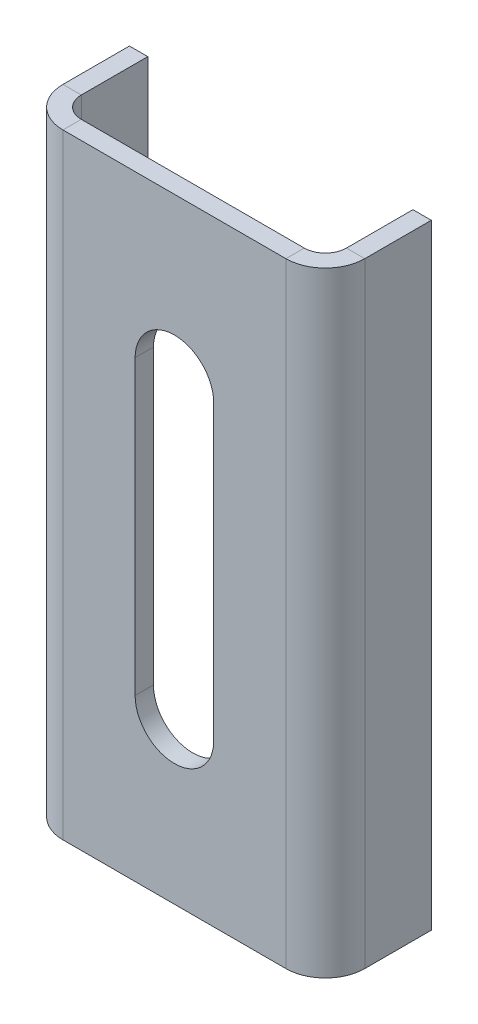
ISO-10303-21;
HEADER;
FILE_DESCRIPTION(('STEP AP214'),'2;1');
FILE_NAME('part.step','',(''),(''),'','','');
FILE_SCHEMA(('AUTOMOTIVE_DESIGN { 1 0 10303 214 1 1 1 1 }'));
ENDSEC;
DATA;
#1=APPLICATION_CONTEXT('core data for automotive mechanical design processes');
#2=APPLICATION_PROTOCOL_DEFINITION('international standard','automotive_design',2000,#1);
#3=PRODUCT_CONTEXT('',#1,'mechanical');
#4=PRODUCT('Part','Part','',(#3));
#5=PRODUCT_RELATED_PRODUCT_CATEGORY('part','',(#4));
#6=PRODUCT_DEFINITION_FORMATION('','',#4);
#7=PRODUCT_DEFINITION_CONTEXT('part definition',#1,'design');
#8=PRODUCT_DEFINITION('design','',#6,#7);
#9=PRODUCT_DEFINITION_SHAPE('','',#8);
#10=(LENGTH_UNIT() NAMED_UNIT(*) SI_UNIT(.MILLI.,.METRE.));
#11=(NAMED_UNIT(*) PLANE_ANGLE_UNIT() SI_UNIT($,.RADIAN.));
#12=(NAMED_UNIT(*) SI_UNIT($,.STERADIAN.) SOLID_ANGLE_UNIT());
#13=UNCERTAINTY_MEASURE_WITH_UNIT(LENGTH_MEASURE(1.E-05),#10,'distance_accuracy_value','');
#14=(GEOMETRIC_REPRESENTATION_CONTEXT(3) GLOBAL_UNCERTAINTY_ASSIGNED_CONTEXT((#13)) GLOBAL_UNIT_ASSIGNED_CONTEXT((#10,
#11,#12)) REPRESENTATION_CONTEXT('',''));
#15=CARTESIAN_POINT('',(0.,0.,0.));
#16=DIRECTION('',(0.,0.,1.));
#17=DIRECTION('',(1.,0.,0.));
#18=AXIS2_PLACEMENT_3D('',#15,#16,#17);
#19=CARTESIAN_POINT('',(2.07,69.36,-2.07));
#20=DIRECTION('',(0.,1.,0.));
#21=DIRECTION('',(-1.,0.,0.));
#22=AXIS2_PLACEMENT_3D('',#19,#20,#21);
#23=PLANE('',#22);
#24=DIRECTION('',(0.,0.,-1.));
#25=VECTOR('',#24,1.);
#26=CARTESIAN_POINT('',(4.450000066,69.36,-2.07));
#27=LINE('',#26,#25);
#28=CARTESIAN_POINT('',(4.450000066,69.36,0.));
#29=VERTEX_POINT('',#28);
#30=CARTESIAN_POINT('',(4.450000066,69.36,-2.07));
#31=VERTEX_POINT('',#30);
#32=EDGE_CURVE('E11',#29,#31,#27,.T.);
#33=ORIENTED_EDGE('',*,*,#32,.F.);
#34=DIRECTION('',(1.,0.,0.));
#35=VECTOR('',#34,1.);
#36=CARTESIAN_POINT('',(2.07,69.36,0.));
#37=LINE('',#36,#35);
#38=CARTESIAN_POINT('',(29.599999934,69.36,0.));
#39=VERTEX_POINT('',#38);
#40=EDGE_CURVE('E270',#39,#29,#37,.F.);
#41=ORIENTED_EDGE('',*,*,#40,.F.);
#42=DIRECTION('',(0.,0.,-1.));
#43=VECTOR('',#42,1.);
#44=CARTESIAN_POINT('',(29.599999934,69.36,-2.07));
#45=LINE('',#44,#43);
#46=CARTESIAN_POINT('',(29.599999934,69.36,-2.07));
#47=VERTEX_POINT('',#46);
#48=EDGE_CURVE('E55',#39,#47,#45,.T.);
#49=ORIENTED_EDGE('',*,*,#48,.T.);
#50=DIRECTION('',(-1.,0.,0.));
#51=VECTOR('',#50,1.);
#52=CARTESIAN_POINT('',(2.07,69.36,-2.07));
#53=LINE('',#52,#51);
#54=EDGE_CURVE('E196',#47,#31,#53,.T.);
#55=ORIENTED_EDGE('',*,*,#54,.T.);
#56=EDGE_LOOP('',(#33,#41,#49,#55));
#57=FACE_BOUND('',#56,.T.);
#58=ADVANCED_FACE('F43',(#57),#23,.T.);
#59=CARTESIAN_POINT('',(29.599999934,69.36,-4.450000066));
#60=DIRECTION('',(0.,1.,0.));
#61=DIRECTION('',(0.,0.,1.));
#62=AXIS2_PLACEMENT_3D('',#59,#60,#61);
#63=PLANE('',#62);
#64=ORIENTED_EDGE('',*,*,#48,.F.);
#65=CARTESIAN_POINT('',(29.599999934,69.36,-4.450000066));
#66=DIRECTION('',(0.,1.,0.));
#67=DIRECTION('',(0.,0.,1.));
#68=AXIS2_PLACEMENT_3D('',#65,#66,#67);
#69=CIRCLE('',#68,4.450000066);
#70=CARTESIAN_POINT('',(34.05,69.36,-4.450000066));
#71=VERTEX_POINT('',#70);
#72=EDGE_CURVE('E266',#39,#71,#69,.T.);
#73=ORIENTED_EDGE('',*,*,#72,.T.);
#74=DIRECTION('',(-1.,0.,0.));
#75=VECTOR('',#74,1.);
#76=CARTESIAN_POINT('',(31.98,69.36,-4.450000066));
#77=LINE('',#76,#75);
#78=CARTESIAN_POINT('',(31.98,69.36,-4.450000066));
#79=VERTEX_POINT('',#78);
#80=EDGE_CURVE('E302',#71,#79,#77,.T.);
#81=ORIENTED_EDGE('',*,*,#80,.T.);
#82=CARTESIAN_POINT('',(29.599999934,69.36,-4.450000066));
#83=DIRECTION('',(0.,-1.,0.));
#84=DIRECTION('',(0.,0.,-1.));
#85=AXIS2_PLACEMENT_3D('',#82,#83,#84);
#86=CIRCLE('',#85,2.380000066);
#87=EDGE_CURVE('E200',#47,#79,#86,.F.);
#88=ORIENTED_EDGE('',*,*,#87,.F.);
#89=EDGE_LOOP('',(#64,#73,#81,#88));
#90=FACE_BOUND('',#89,.T.);
#91=ADVANCED_FACE('F317',(#90),#63,.T.);
#92=CARTESIAN_POINT('',(31.98,69.36,-2.07));
#93=DIRECTION('',(0.,1.,0.));
#94=DIRECTION('',(0.,0.,1.));
#95=AXIS2_PLACEMENT_3D('',#92,#93,#94);
#96=PLANE('',#95);
#97=ORIENTED_EDGE('',*,*,#80,.F.);
#98=DIRECTION('',(0.,0.,-1.));
#99=VECTOR('',#98,1.);
#100=CARTESIAN_POINT('',(34.05,69.36,-2.07));
#101=LINE('',#100,#99);
#102=CARTESIAN_POINT('',(34.05,69.36,-11.95));
#103=VERTEX_POINT('',#102);
#104=EDGE_CURVE('E276',#103,#71,#101,.F.);
#105=ORIENTED_EDGE('',*,*,#104,.F.);
#106=DIRECTION('',(-1.,0.,0.));
#107=VECTOR('',#106,1.);
#108=CARTESIAN_POINT('',(31.98,69.36,-11.95));
#109=LINE('',#108,#107);
#110=CARTESIAN_POINT('',(31.98,69.36,-11.95));
#111=VERTEX_POINT('',#110);
#112=EDGE_CURVE('E305',#103,#111,#109,.T.);
#113=ORIENTED_EDGE('',*,*,#112,.T.);
#114=DIRECTION('',(0.,0.,1.));
#115=VECTOR('',#114,1.);
#116=CARTESIAN_POINT('',(31.98,69.36,-2.07));
#117=LINE('',#116,#115);
#118=EDGE_CURVE('E202',#111,#79,#117,.T.);
#119=ORIENTED_EDGE('',*,*,#118,.T.);
#120=EDGE_LOOP('',(#97,#105,#113,#119));
#121=FACE_BOUND('',#120,.T.);
#122=ADVANCED_FACE('F361',(#121),#96,.T.);
#123=CARTESIAN_POINT('',(31.98,69.36,-11.95));
#124=DIRECTION('',(0.,0.,1.));
#125=DIRECTION('',(0.,-1.,0.));
#126=AXIS2_PLACEMENT_3D('',#123,#124,#125);
#127=PLANE('',#126);
#128=ORIENTED_EDGE('',*,*,#112,.F.);
#129=DIRECTION('',(0.,1.,0.));
#130=VECTOR('',#129,1.);
#131=CARTESIAN_POINT('',(34.05,69.36,-11.95));
#132=LINE('',#131,#130);
#133=CARTESIAN_POINT('',(34.05,0.,-11.95));
#134=VERTEX_POINT('',#133);
#135=EDGE_CURVE('E265',#103,#134,#132,.F.);
#136=ORIENTED_EDGE('',*,*,#135,.T.);
#137=DIRECTION('',(-1.,0.,0.));
#138=VECTOR('',#137,1.);
#139=CARTESIAN_POINT('',(31.98,0.,-11.95));
#140=LINE('',#139,#138);
#141=CARTESIAN_POINT('',(31.98,0.,-11.95));
#142=VERTEX_POINT('',#141);
#143=EDGE_CURVE('E297',#134,#142,#140,.T.);
#144=ORIENTED_EDGE('',*,*,#143,.T.);
#145=DIRECTION('',(0.,-1.,0.));
#146=VECTOR('',#145,1.);
#147=CARTESIAN_POINT('',(31.98,69.36,-11.95));
#148=LINE('',#147,#146);
#149=EDGE_CURVE('E207',#111,#142,#148,.T.);
#150=ORIENTED_EDGE('',*,*,#149,.F.);
#151=EDGE_LOOP('',(#128,#136,#144,#150));
#152=FACE_BOUND('',#151,.T.);
#153=ADVANCED_FACE('F378',(#152),#127,.F.);
#154=CARTESIAN_POINT('',(31.98,0.,-2.07));
#155=DIRECTION('',(0.,1.,0.));
#156=DIRECTION('',(0.,0.,1.));
#157=AXIS2_PLACEMENT_3D('',#154,#155,#156);
#158=PLANE('',#157);
#159=ORIENTED_EDGE('',*,*,#143,.F.);
#160=DIRECTION('',(0.,0.,-1.));
#161=VECTOR('',#160,1.);
#162=CARTESIAN_POINT('',(34.05,0.,-2.07));
#163=LINE('',#162,#161);
#164=CARTESIAN_POINT('',(34.05,0.,-4.450000066));
#165=VERTEX_POINT('',#164);
#166=EDGE_CURVE('E274',#134,#165,#163,.F.);
#167=ORIENTED_EDGE('',*,*,#166,.T.);
#168=DIRECTION('',(-1.,0.,0.));
#169=VECTOR('',#168,1.);
#170=CARTESIAN_POINT('',(31.98,0.,-4.450000066));
#171=LINE('',#170,#169);
#172=CARTESIAN_POINT('',(31.98,0.,-4.450000066));
#173=VERTEX_POINT('',#172);
#174=EDGE_CURVE('E296',#165,#173,#171,.T.);
#175=ORIENTED_EDGE('',*,*,#174,.T.);
#176=DIRECTION('',(0.,0.,1.));
#177=VECTOR('',#176,1.);
#178=CARTESIAN_POINT('',(31.98,0.,-2.07));
#179=LINE('',#178,#177);
#180=EDGE_CURVE('E199',#142,#173,#179,.T.);
#181=ORIENTED_EDGE('',*,*,#180,.F.);
#182=EDGE_LOOP('',(#159,#167,#175,#181));
#183=FACE_BOUND('',#182,.T.);
#184=ADVANCED_FACE('F369',(#183),#158,.F.);
#185=CARTESIAN_POINT('',(29.599999934,0.,-4.450000066));
#186=DIRECTION('',(0.,-1.,0.));
#187=DIRECTION('',(0.,0.,-1.));
#188=AXIS2_PLACEMENT_3D('',#185,#186,#187);
#189=PLANE('',#188);
#190=ORIENTED_EDGE('',*,*,#174,.F.);
#191=CARTESIAN_POINT('',(29.599999934,0.,-4.450000066));
#192=DIRECTION('',(0.,1.,0.));
#193=DIRECTION('',(0.,0.,1.));
#194=AXIS2_PLACEMENT_3D('',#191,#192,#193);
#195=CIRCLE('',#194,4.450000066);
#196=CARTESIAN_POINT('',(29.599999934,0.,0.));
#197=VERTEX_POINT('',#196);
#198=EDGE_CURVE('E272',#165,#197,#195,.F.);
#199=ORIENTED_EDGE('',*,*,#198,.T.);
#200=DIRECTION('',(0.,0.,-1.));
#201=VECTOR('',#200,1.);
#202=CARTESIAN_POINT('',(29.599999934,0.,-2.07));
#203=LINE('',#202,#201);
#204=CARTESIAN_POINT('',(29.599999934,0.,-2.07));
#205=VERTEX_POINT('',#204);
#206=EDGE_CURVE('E298',#197,#205,#203,.T.);
#207=ORIENTED_EDGE('',*,*,#206,.T.);
#208=CARTESIAN_POINT('',(29.599999934,0.,-4.450000066));
#209=DIRECTION('',(0.,1.,0.));
#210=DIRECTION('',(0.,0.,1.));
#211=AXIS2_PLACEMENT_3D('',#208,#209,#210);
#212=CIRCLE('',#211,2.380000066);
#213=EDGE_CURVE('E224',#173,#205,#212,.F.);
#214=ORIENTED_EDGE('',*,*,#213,.F.);
#215=EDGE_LOOP('',(#190,#199,#207,#214));
#216=FACE_BOUND('',#215,.T.);
#217=ADVANCED_FACE('F371',(#216),#189,.T.);
#218=CARTESIAN_POINT('',(2.07,0.,-2.07));
#219=DIRECTION('',(0.,1.,0.));
#220=DIRECTION('',(-1.,0.,0.));
#221=AXIS2_PLACEMENT_3D('',#218,#219,#220);
#222=PLANE('',#221);
#223=ORIENTED_EDGE('',*,*,#206,.F.);
#224=DIRECTION('',(1.,0.,0.));
#225=VECTOR('',#224,1.);
#226=CARTESIAN_POINT('',(2.07,0.,0.));
#227=LINE('',#226,#225);
#228=CARTESIAN_POINT('',(4.450000066,0.,0.));
#229=VERTEX_POINT('',#228);
#230=EDGE_CURVE('E268',#197,#229,#227,.F.);
#231=ORIENTED_EDGE('',*,*,#230,.T.);
#232=DIRECTION('',(0.,0.,-1.));
#233=VECTOR('',#232,1.);
#234=CARTESIAN_POINT('',(4.450000066,0.,-2.07));
#235=LINE('',#234,#233);
#236=CARTESIAN_POINT('',(4.450000066,0.,-2.07));
#237=VERTEX_POINT('',#236);
#238=EDGE_CURVE('E295',#229,#237,#235,.T.);
#239=ORIENTED_EDGE('',*,*,#238,.T.);
#240=DIRECTION('',(-1.,0.,0.));
#241=VECTOR('',#240,1.);
#242=CARTESIAN_POINT('',(2.07,0.,-2.07));
#243=LINE('',#242,#241);
#244=EDGE_CURVE('E192',#205,#237,#243,.T.);
#245=ORIENTED_EDGE('',*,*,#244,.F.);
#246=EDGE_LOOP('',(#223,#231,#239,#245));
#247=FACE_BOUND('',#246,.T.);
#248=ADVANCED_FACE('F323',(#247),#222,.F.);
#249=CARTESIAN_POINT('',(4.450000066,0.,-4.450000066));
#250=DIRECTION('',(0.,-1.,0.));
#251=DIRECTION('',(0.,0.,-1.));
#252=AXIS2_PLACEMENT_3D('',#249,#250,#251);
#253=PLANE('',#252);
#254=ORIENTED_EDGE('',*,*,#238,.F.);
#255=CARTESIAN_POINT('',(4.450000066,0.,-4.450000066));
#256=DIRECTION('',(0.,1.,0.));
#257=DIRECTION('',(0.,0.,1.));
#258=AXIS2_PLACEMENT_3D('',#255,#256,#257);
#259=CIRCLE('',#258,4.450000066);
#260=CARTESIAN_POINT('',(0.,0.,-4.450000066));
#261=VERTEX_POINT('',#260);
#262=EDGE_CURVE('E186',#229,#261,#259,.F.);
#263=ORIENTED_EDGE('',*,*,#262,.T.);
#264=DIRECTION('',(1.,0.,0.));
#265=VECTOR('',#264,1.);
#266=CARTESIAN_POINT('',(2.07,0.,-4.450000066));
#267=LINE('',#266,#265);
#268=CARTESIAN_POINT('',(2.07,0.,-4.450000066));
#269=VERTEX_POINT('',#268);
#270=EDGE_CURVE('E292',#261,#269,#267,.T.);
#271=ORIENTED_EDGE('',*,*,#270,.T.);
#272=CARTESIAN_POINT('',(4.450000066,0.,-4.450000066));
#273=DIRECTION('',(0.,1.,0.));
#274=DIRECTION('',(0.,0.,1.));
#275=AXIS2_PLACEMENT_3D('',#272,#273,#274);
#276=CIRCLE('',#275,2.380000066);
#277=EDGE_CURVE('E236',#237,#269,#276,.F.);
#278=ORIENTED_EDGE('',*,*,#277,.F.);
#279=EDGE_LOOP('',(#254,#263,#271,#278));
#280=FACE_BOUND('',#279,.T.);
#281=ADVANCED_FACE('F330',(#280),#253,.T.);
#282=CARTESIAN_POINT('',(2.07,0.,-11.95));
#283=DIRECTION('',(0.,1.,0.));
#284=DIRECTION('',(0.,0.,-1.));
#285=AXIS2_PLACEMENT_3D('',#282,#283,#284);
#286=PLANE('',#285);
#287=ORIENTED_EDGE('',*,*,#270,.F.);
#288=DIRECTION('',(0.,0.,1.));
#289=VECTOR('',#288,1.);
#290=CARTESIAN_POINT('',(0.,0.,-11.95));
#291=LINE('',#290,#289);
#292=CARTESIAN_POINT('',(0.,0.,-11.95));
#293=VERTEX_POINT('',#292);
#294=EDGE_CURVE('E258',#261,#293,#291,.F.);
#295=ORIENTED_EDGE('',*,*,#294,.T.);
#296=DIRECTION('',(1.,0.,0.));
#297=VECTOR('',#296,1.);
#298=CARTESIAN_POINT('',(2.07,0.,-11.95));
#299=LINE('',#298,#297);
#300=CARTESIAN_POINT('',(2.07,0.,-11.95));
#301=VERTEX_POINT('',#300);
#302=EDGE_CURVE('E289',#293,#301,#299,.T.);
#303=ORIENTED_EDGE('',*,*,#302,.T.);
#304=DIRECTION('',(0.,0.,-1.));
#305=VECTOR('',#304,1.);
#306=CARTESIAN_POINT('',(2.07,0.,-11.95));
#307=LINE('',#306,#305);
#308=EDGE_CURVE('E209',#269,#301,#307,.T.);
#309=ORIENTED_EDGE('',*,*,#308,.F.);
#310=EDGE_LOOP('',(#287,#295,#303,#309));
#311=FACE_BOUND('',#310,.T.);
#312=ADVANCED_FACE('F430',(#311),#286,.F.);
#313=CARTESIAN_POINT('',(2.07,69.36,-11.95));
#314=DIRECTION('',(0.,0.,-1.));
#315=DIRECTION('',(0.,-1.,0.));
#316=AXIS2_PLACEMENT_3D('',#313,#314,#315);
#317=PLANE('',#316);
#318=ORIENTED_EDGE('',*,*,#302,.F.);
#319=DIRECTION('',(0.,1.,0.));
#320=VECTOR('',#319,1.);
#321=CARTESIAN_POINT('',(0.,69.36,-11.95));
#322=LINE('',#321,#320);
#323=CARTESIAN_POINT('',(0.,69.36,-11.95));
#324=VERTEX_POINT('',#323);
#325=EDGE_CURVE('E256',#324,#293,#322,.F.);
#326=ORIENTED_EDGE('',*,*,#325,.F.);
#327=DIRECTION('',(1.,0.,0.));
#328=VECTOR('',#327,1.);
#329=CARTESIAN_POINT('',(2.07,69.36,-11.95));
#330=LINE('',#329,#328);
#331=CARTESIAN_POINT('',(2.07,69.36,-11.95));
#332=VERTEX_POINT('',#331);
#333=EDGE_CURVE('E286',#324,#332,#330,.T.);
#334=ORIENTED_EDGE('',*,*,#333,.T.);
#335=DIRECTION('',(0.,-1.,0.));
#336=VECTOR('',#335,1.);
#337=CARTESIAN_POINT('',(2.07,69.36,-11.95));
#338=LINE('',#337,#336);
#339=EDGE_CURVE('E211',#332,#301,#338,.T.);
#340=ORIENTED_EDGE('',*,*,#339,.T.);
#341=EDGE_LOOP('',(#318,#326,#334,#340));
#342=FACE_BOUND('',#341,.T.);
#343=ADVANCED_FACE('F440',(#342),#317,.T.);
#344=CARTESIAN_POINT('',(2.07,69.36,-11.95));
#345=DIRECTION('',(0.,1.,0.));
#346=DIRECTION('',(0.,0.,-1.));
#347=AXIS2_PLACEMENT_3D('',#344,#345,#346);
#348=PLANE('',#347);
#349=ORIENTED_EDGE('',*,*,#333,.F.);
#350=DIRECTION('',(0.,0.,1.));
#351=VECTOR('',#350,1.);
#352=CARTESIAN_POINT('',(0.,69.36,-11.95));
#353=LINE('',#352,#351);
#354=CARTESIAN_POINT('',(0.,69.36,-4.450000066));
#355=VERTEX_POINT('',#354);
#356=EDGE_CURVE('E252',#355,#324,#353,.F.);
#357=ORIENTED_EDGE('',*,*,#356,.F.);
#358=DIRECTION('',(1.,0.,0.));
#359=VECTOR('',#358,1.);
#360=CARTESIAN_POINT('',(2.07,69.36,-4.450000066));
#361=LINE('',#360,#359);
#362=CARTESIAN_POINT('',(2.07,69.36,-4.450000066));
#363=VERTEX_POINT('',#362);
#364=EDGE_CURVE('E50',#355,#363,#361,.T.);
#365=ORIENTED_EDGE('',*,*,#364,.T.);
#366=DIRECTION('',(0.,0.,-1.));
#367=VECTOR('',#366,1.);
#368=CARTESIAN_POINT('',(2.07,69.36,-11.95));
#369=LINE('',#368,#367);
#370=EDGE_CURVE('E212',#363,#332,#369,.T.);
#371=ORIENTED_EDGE('',*,*,#370,.T.);
#372=EDGE_LOOP('',(#349,#357,#365,#371));
#373=FACE_BOUND('',#372,.T.);
#374=ADVANCED_FACE('F344',(#373),#348,.T.);
#375=CARTESIAN_POINT('',(4.450000066,69.36,-4.450000066));
#376=DIRECTION('',(0.,1.,0.));
#377=DIRECTION('',(0.,0.,1.));
#378=AXIS2_PLACEMENT_3D('',#375,#376,#377);
#379=PLANE('',#378);
#380=CARTESIAN_POINT('',(4.450000066,69.36,-4.450000066));
#381=DIRECTION('',(0.,1.,0.));
#382=DIRECTION('',(0.,0.,1.));
#383=AXIS2_PLACEMENT_3D('',#380,#381,#382);
#384=CIRCLE('',#383,4.450000066);
#385=EDGE_CURVE('E264',#355,#29,#384,.T.);
#386=ORIENTED_EDGE('',*,*,#385,.T.);
#387=ORIENTED_EDGE('',*,*,#32,.T.);
#388=CARTESIAN_POINT('',(4.450000066,69.36,-4.450000066));
#389=DIRECTION('',(0.,-1.,0.));
#390=DIRECTION('',(0.,0.,-1.));
#391=AXIS2_PLACEMENT_3D('',#388,#389,#390);
#392=CIRCLE('',#391,2.380000066);
#393=EDGE_CURVE('E226',#363,#31,#392,.F.);
#394=ORIENTED_EDGE('',*,*,#393,.F.);
#395=ORIENTED_EDGE('',*,*,#364,.F.);
#396=EDGE_LOOP('',(#386,#387,#394,#395));
#397=FACE_BOUND('',#396,.T.);
#398=ADVANCED_FACE('F44',(#397),#379,.T.);
#399=CARTESIAN_POINT('',(2.07,69.36,-11.95));
#400=DIRECTION('',(-1.,0.,0.));
#401=DIRECTION('',(0.,0.,1.));
#402=AXIS2_PLACEMENT_3D('',#399,#400,#401);
#403=PLANE('',#402);
#404=ORIENTED_EDGE('',*,*,#370,.F.);
#405=DIRECTION('',(0.,-1.,0.));
#406=VECTOR('',#405,1.);
#407=CARTESIAN_POINT('',(2.07,0.,-4.450000066));
#408=LINE('',#407,#406);
#409=EDGE_CURVE('E222',#363,#269,#408,.T.);
#410=ORIENTED_EDGE('',*,*,#409,.T.);
#411=ORIENTED_EDGE('',*,*,#308,.T.);
#412=ORIENTED_EDGE('',*,*,#339,.F.);
#413=EDGE_LOOP('',(#404,#410,#411,#412));
#414=FACE_BOUND('',#413,.T.);
#415=ADVANCED_FACE('F339',(#414),#403,.F.);
#416=CARTESIAN_POINT('',(31.98,69.36,-2.07));
#417=DIRECTION('',(1.,0.,0.));
#418=DIRECTION('',(0.,0.,-1.));
#419=AXIS2_PLACEMENT_3D('',#416,#417,#418);
#420=PLANE('',#419);
#421=ORIENTED_EDGE('',*,*,#180,.T.);
#422=DIRECTION('',(0.,-1.,0.));
#423=VECTOR('',#422,1.);
#424=CARTESIAN_POINT('',(31.98,69.36,-4.450000066));
#425=LINE('',#424,#423);
#426=EDGE_CURVE('E223',#173,#79,#425,.F.);
#427=ORIENTED_EDGE('',*,*,#426,.T.);
#428=ORIENTED_EDGE('',*,*,#118,.F.);
#429=ORIENTED_EDGE('',*,*,#149,.T.);
#430=EDGE_LOOP('',(#421,#427,#428,#429));
#431=FACE_BOUND('',#430,.T.);
#432=ADVANCED_FACE('F370',(#431),#420,.F.);
#433=CARTESIAN_POINT('',(2.07,69.36,-2.07));
#434=DIRECTION('',(0.,0.,1.));
#435=DIRECTION('',(1.,0.,0.));
#436=AXIS2_PLACEMENT_3D('',#433,#434,#435);
#437=PLANE('',#436);
#438=DIRECTION('',(0.,1.,0.));
#439=VECTOR('',#438,1.);
#440=CARTESIAN_POINT('',(12.59,18.18,-2.07));
#441=LINE('',#440,#439);
#442=CARTESIAN_POINT('',(12.59,18.18,-2.07));
#443=VERTEX_POINT('',#442);
#444=CARTESIAN_POINT('',(12.59,51.18,-2.07));
#445=VERTEX_POINT('',#444);
#446=EDGE_CURVE('E182',#443,#445,#441,.T.);
#447=ORIENTED_EDGE('',*,*,#446,.F.);
#448=CARTESIAN_POINT('',(17.025,18.18,-2.07));
#449=DIRECTION('',(0.,0.,-1.));
#450=DIRECTION('',(-1.,0.,0.));
#451=AXIS2_PLACEMENT_3D('',#448,#449,#450);
#452=CIRCLE('',#451,4.435);
#453=CARTESIAN_POINT('',(21.46,18.18,-2.07));
#454=VERTEX_POINT('',#453);
#455=EDGE_CURVE('E56',#454,#443,#452,.T.);
#456=ORIENTED_EDGE('',*,*,#455,.F.);
#457=DIRECTION('',(0.,-1.,0.));
#458=VECTOR('',#457,1.);
#459=CARTESIAN_POINT('',(21.46,18.18,-2.07));
#460=LINE('',#459,#458);
#461=CARTESIAN_POINT('',(21.46,51.18,-2.07));
#462=VERTEX_POINT('',#461);
#463=EDGE_CURVE('E172',#462,#454,#460,.T.);
#464=ORIENTED_EDGE('',*,*,#463,.F.);
#465=CARTESIAN_POINT('',(17.025,51.18,-2.07));
#466=DIRECTION('',(0.,0.,-1.));
#467=DIRECTION('',(-1.,0.,0.));
#468=AXIS2_PLACEMENT_3D('',#465,#466,#467);
#469=CIRCLE('',#468,4.435);
#470=EDGE_CURVE('E180',#445,#462,#469,.T.);
#471=ORIENTED_EDGE('',*,*,#470,.F.);
#472=EDGE_LOOP('',(#447,#456,#464,#471));
#473=FACE_BOUND('',#472,.T.);
#474=ORIENTED_EDGE('',*,*,#244,.T.);
#475=DIRECTION('',(0.,-1.,0.));
#476=VECTOR('',#475,1.);
#477=CARTESIAN_POINT('',(4.450000066,69.36,-2.07));
#478=LINE('',#477,#476);
#479=EDGE_CURVE('E231',#237,#31,#478,.F.);
#480=ORIENTED_EDGE('',*,*,#479,.T.);
#481=ORIENTED_EDGE('',*,*,#54,.F.);
#482=DIRECTION('',(0.,-1.,0.));
#483=VECTOR('',#482,1.);
#484=CARTESIAN_POINT('',(29.599999934,0.,-2.07));
#485=LINE('',#484,#483);
#486=EDGE_CURVE('E220',#47,#205,#485,.T.);
#487=ORIENTED_EDGE('',*,*,#486,.T.);
#488=EDGE_LOOP('',(#474,#480,#481,#487));
#489=FACE_BOUND('',#488,.T.);
#490=ADVANCED_FACE('F312',(#473,#489),#437,.F.);
#491=CARTESIAN_POINT('',(29.599999934,69.36,-4.450000066));
#492=DIRECTION('',(0.,1.,0.));
#493=DIRECTION('',(0.,0.,1.));
#494=AXIS2_PLACEMENT_3D('',#491,#492,#493);
#495=CYLINDRICAL_SURFACE('',#494,2.380000066);
#496=ORIENTED_EDGE('',*,*,#87,.T.);
#497=ORIENTED_EDGE('',*,*,#426,.F.);
#498=ORIENTED_EDGE('',*,*,#213,.T.);
#499=ORIENTED_EDGE('',*,*,#486,.F.);
#500=EDGE_LOOP('',(#496,#497,#498,#499));
#501=FACE_BOUND('',#500,.T.);
#502=ADVANCED_FACE('F316',(#501),#495,.F.);
#503=CARTESIAN_POINT('',(4.450000066,69.36,-4.450000066));
#504=DIRECTION('',(0.,1.,0.));
#505=DIRECTION('',(0.,0.,1.));
#506=AXIS2_PLACEMENT_3D('',#503,#504,#505);
#507=CYLINDRICAL_SURFACE('',#506,2.380000066);
#508=ORIENTED_EDGE('',*,*,#393,.T.);
#509=ORIENTED_EDGE('',*,*,#479,.F.);
#510=ORIENTED_EDGE('',*,*,#277,.T.);
#511=ORIENTED_EDGE('',*,*,#409,.F.);
#512=EDGE_LOOP('',(#508,#509,#510,#511));
#513=FACE_BOUND('',#512,.T.);
#514=ADVANCED_FACE('F334',(#513),#507,.F.);
#515=CARTESIAN_POINT('',(0.,69.36,-11.95));
#516=DIRECTION('',(-1.,0.,0.));
#517=DIRECTION('',(0.,0.,1.));
#518=AXIS2_PLACEMENT_3D('',#515,#516,#517);
#519=PLANE('',#518);
#520=ORIENTED_EDGE('',*,*,#356,.T.);
#521=ORIENTED_EDGE('',*,*,#325,.T.);
#522=ORIENTED_EDGE('',*,*,#294,.F.);
#523=DIRECTION('',(0.,1.,0.));
#524=VECTOR('',#523,1.);
#525=CARTESIAN_POINT('',(0.,69.36,-4.450000066));
#526=LINE('',#525,#524);
#527=EDGE_CURVE('E245',#355,#261,#526,.F.);
#528=ORIENTED_EDGE('',*,*,#527,.F.);
#529=EDGE_LOOP('',(#520,#521,#522,#528));
#530=FACE_BOUND('',#529,.T.);
#531=ADVANCED_FACE('F342',(#530),#519,.T.);
#532=CARTESIAN_POINT('',(34.05,69.36,-2.07));
#533=DIRECTION('',(1.,0.,0.));
#534=DIRECTION('',(0.,0.,-1.));
#535=AXIS2_PLACEMENT_3D('',#532,#533,#534);
#536=PLANE('',#535);
#537=ORIENTED_EDGE('',*,*,#166,.F.);
#538=ORIENTED_EDGE('',*,*,#135,.F.);
#539=ORIENTED_EDGE('',*,*,#104,.T.);
#540=DIRECTION('',(0.,1.,0.));
#541=VECTOR('',#540,1.);
#542=CARTESIAN_POINT('',(34.05,69.36,-4.450000066));
#543=LINE('',#542,#541);
#544=EDGE_CURVE('E244',#165,#71,#543,.T.);
#545=ORIENTED_EDGE('',*,*,#544,.F.);
#546=EDGE_LOOP('',(#537,#538,#539,#545));
#547=FACE_BOUND('',#546,.T.);
#548=ADVANCED_FACE('F363',(#547),#536,.T.);
#549=CARTESIAN_POINT('',(2.07,69.36,0.));
#550=DIRECTION('',(0.,0.,1.));
#551=DIRECTION('',(1.,0.,0.));
#552=AXIS2_PLACEMENT_3D('',#549,#550,#551);
#553=PLANE('',#552);
#554=CARTESIAN_POINT('',(17.025,18.18,0.));
#555=DIRECTION('',(0.,0.,-1.));
#556=DIRECTION('',(-1.,0.,0.));
#557=AXIS2_PLACEMENT_3D('',#554,#555,#556);
#558=CIRCLE('',#557,4.435);
#559=CARTESIAN_POINT('',(21.46,18.18,0.));
#560=VERTEX_POINT('',#559);
#561=CARTESIAN_POINT('',(12.59,18.18,0.));
#562=VERTEX_POINT('',#561);
#563=EDGE_CURVE('E156',#560,#562,#558,.T.);
#564=ORIENTED_EDGE('',*,*,#563,.T.);
#565=DIRECTION('',(0.,1.,0.));
#566=VECTOR('',#565,1.);
#567=CARTESIAN_POINT('',(12.59,18.18,0.));
#568=LINE('',#567,#566);
#569=CARTESIAN_POINT('',(12.59,51.18,0.));
#570=VERTEX_POINT('',#569);
#571=EDGE_CURVE('E170',#562,#570,#568,.T.);
#572=ORIENTED_EDGE('',*,*,#571,.T.);
#573=CARTESIAN_POINT('',(17.025,51.18,0.));
#574=DIRECTION('',(0.,0.,-1.));
#575=DIRECTION('',(-1.,0.,0.));
#576=AXIS2_PLACEMENT_3D('',#573,#574,#575);
#577=CIRCLE('',#576,4.435);
#578=CARTESIAN_POINT('',(21.46,51.18,0.));
#579=VERTEX_POINT('',#578);
#580=EDGE_CURVE('E70',#570,#579,#577,.T.);
#581=ORIENTED_EDGE('',*,*,#580,.T.);
#582=DIRECTION('',(0.,-1.,0.));
#583=VECTOR('',#582,1.);
#584=CARTESIAN_POINT('',(21.46,18.18,0.));
#585=LINE('',#584,#583);
#586=EDGE_CURVE('E165',#579,#560,#585,.T.);
#587=ORIENTED_EDGE('',*,*,#586,.T.);
#588=EDGE_LOOP('',(#564,#572,#581,#587));
#589=FACE_BOUND('',#588,.T.);
#590=ORIENTED_EDGE('',*,*,#230,.F.);
#591=DIRECTION('',(0.,1.,0.));
#592=VECTOR('',#591,1.);
#593=CARTESIAN_POINT('',(29.599999934,69.36,0.));
#594=LINE('',#593,#592);
#595=EDGE_CURVE('E247',#39,#197,#594,.F.);
#596=ORIENTED_EDGE('',*,*,#595,.F.);
#597=ORIENTED_EDGE('',*,*,#40,.T.);
#598=DIRECTION('',(0.,1.,0.));
#599=VECTOR('',#598,1.);
#600=CARTESIAN_POINT('',(4.450000066,69.36,0.));
#601=LINE('',#600,#599);
#602=EDGE_CURVE('E237',#229,#29,#601,.T.);
#603=ORIENTED_EDGE('',*,*,#602,.F.);
#604=EDGE_LOOP('',(#590,#596,#597,#603));
#605=FACE_BOUND('',#604,.T.);
#606=ADVANCED_FACE('F171',(#589,#605),#553,.T.);
#607=CARTESIAN_POINT('',(29.599999934,69.36,-4.450000066));
#608=DIRECTION('',(0.,1.,0.));
#609=DIRECTION('',(0.,0.,1.));
#610=AXIS2_PLACEMENT_3D('',#607,#608,#609);
#611=CYLINDRICAL_SURFACE('',#610,4.450000066);
#612=ORIENTED_EDGE('',*,*,#72,.F.);
#613=ORIENTED_EDGE('',*,*,#595,.T.);
#614=ORIENTED_EDGE('',*,*,#198,.F.);
#615=ORIENTED_EDGE('',*,*,#544,.T.);
#616=EDGE_LOOP('',(#612,#613,#614,#615));
#617=FACE_BOUND('',#616,.T.);
#618=ADVANCED_FACE('F354',(#617),#611,.T.);
#619=CARTESIAN_POINT('',(4.450000066,69.36,-4.450000066));
#620=DIRECTION('',(0.,1.,0.));
#621=DIRECTION('',(0.,0.,1.));
#622=AXIS2_PLACEMENT_3D('',#619,#620,#621);
#623=CYLINDRICAL_SURFACE('',#622,4.450000066);
#624=ORIENTED_EDGE('',*,*,#385,.F.);
#625=ORIENTED_EDGE('',*,*,#527,.T.);
#626=ORIENTED_EDGE('',*,*,#262,.F.);
#627=ORIENTED_EDGE('',*,*,#602,.T.);
#628=EDGE_LOOP('',(#624,#625,#626,#627));
#629=FACE_BOUND('',#628,.T.);
#630=ADVANCED_FACE('F348',(#629),#623,.T.);
#631=CARTESIAN_POINT('',(17.025,18.18,0.));
#632=DIRECTION('',(0.,0.,-1.));
#633=DIRECTION('',(-1.,0.,0.));
#634=AXIS2_PLACEMENT_3D('',#631,#632,#633);
#635=CYLINDRICAL_SURFACE('',#634,4.435);
#636=ORIENTED_EDGE('',*,*,#455,.T.);
#637=DIRECTION('',(0.,0.,-1.));
#638=VECTOR('',#637,1.);
#639=CARTESIAN_POINT('',(12.59,18.18,0.));
#640=LINE('',#639,#638);
#641=EDGE_CURVE('E151',#562,#443,#640,.T.);
#642=ORIENTED_EDGE('',*,*,#641,.F.);
#643=ORIENTED_EDGE('',*,*,#563,.F.);
#644=DIRECTION('',(0.,0.,-1.));
#645=VECTOR('',#644,1.);
#646=CARTESIAN_POINT('',(21.46,18.18,0.));
#647=LINE('',#646,#645);
#648=EDGE_CURVE('E190',#560,#454,#647,.T.);
#649=ORIENTED_EDGE('',*,*,#648,.T.);
#650=EDGE_LOOP('',(#636,#642,#643,#649));
#651=FACE_BOUND('',#650,.T.);
#652=ADVANCED_FACE('F158',(#651),#635,.F.);
#653=CARTESIAN_POINT('',(21.46,18.18,0.));
#654=DIRECTION('',(1.,0.,0.));
#655=DIRECTION('',(0.,1.,0.));
#656=AXIS2_PLACEMENT_3D('',#653,#654,#655);
#657=PLANE('',#656);
#658=ORIENTED_EDGE('',*,*,#463,.T.);
#659=ORIENTED_EDGE('',*,*,#648,.F.);
#660=ORIENTED_EDGE('',*,*,#586,.F.);
#661=DIRECTION('',(0.,0.,-1.));
#662=VECTOR('',#661,1.);
#663=CARTESIAN_POINT('',(21.46,51.18,0.));
#664=LINE('',#663,#662);
#665=EDGE_CURVE('E188',#579,#462,#664,.T.);
#666=ORIENTED_EDGE('',*,*,#665,.T.);
#667=EDGE_LOOP('',(#658,#659,#660,#666));
#668=FACE_BOUND('',#667,.T.);
#669=ADVANCED_FACE('F567',(#668),#657,.F.);
#670=CARTESIAN_POINT('',(17.025,51.18,0.));
#671=DIRECTION('',(0.,0.,-1.));
#672=DIRECTION('',(-1.,0.,0.));
#673=AXIS2_PLACEMENT_3D('',#670,#671,#672);
#674=CYLINDRICAL_SURFACE('',#673,4.435);
#675=ORIENTED_EDGE('',*,*,#470,.T.);
#676=ORIENTED_EDGE('',*,*,#665,.F.);
#677=ORIENTED_EDGE('',*,*,#580,.F.);
#678=DIRECTION('',(0.,0.,-1.));
#679=VECTOR('',#678,1.);
#680=CARTESIAN_POINT('',(12.59,51.18,0.));
#681=LINE('',#680,#679);
#682=EDGE_CURVE('E161',#570,#445,#681,.T.);
#683=ORIENTED_EDGE('',*,*,#682,.T.);
#684=EDGE_LOOP('',(#675,#676,#677,#683));
#685=FACE_BOUND('',#684,.T.);
#686=ADVANCED_FACE('F576',(#685),#674,.F.);
#687=CARTESIAN_POINT('',(12.59,18.18,0.));
#688=DIRECTION('',(-1.,0.,0.));
#689=DIRECTION('',(0.,-1.,0.));
#690=AXIS2_PLACEMENT_3D('',#687,#688,#689);
#691=PLANE('',#690);
#692=ORIENTED_EDGE('',*,*,#446,.T.);
#693=ORIENTED_EDGE('',*,*,#682,.F.);
#694=ORIENTED_EDGE('',*,*,#571,.F.);
#695=ORIENTED_EDGE('',*,*,#641,.T.);
#696=EDGE_LOOP('',(#692,#693,#694,#695));
#697=FACE_BOUND('',#696,.T.);
#698=ADVANCED_FACE('F166',(#697),#691,.F.);
#699=CLOSED_SHELL('',(#58,#91,#122,#153,#184,#217,#248,#281,#312,#343,#374,#398,#415,#432,#490,
#502,#514,#531,#548,#606,#618,#630,#652,#669,#686,#698));
#700=MANIFOLD_SOLID_BREP('B2',#699);
#701=ADVANCED_BREP_SHAPE_REPRESENTATION('',(#18,#700),#14);
#702=SHAPE_DEFINITION_REPRESENTATION(#9,#701);
ENDSEC;
END-ISO-10303-21;
